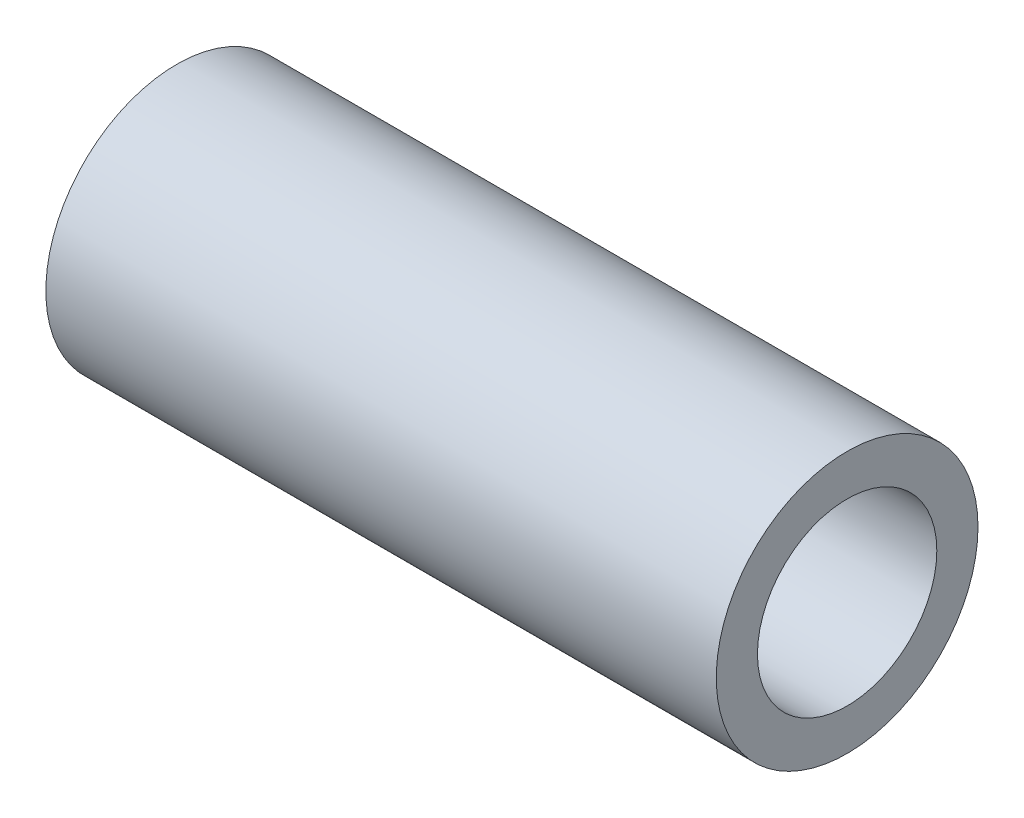
ISO-10303-21;
HEADER;
FILE_DESCRIPTION(('STEP AP214'),'2;1');
FILE_NAME('part.step','',(''),(''),'','','');
FILE_SCHEMA(('AUTOMOTIVE_DESIGN { 1 0 10303 214 1 1 1 1 }'));
ENDSEC;
DATA;
#1=APPLICATION_CONTEXT('core data for automotive mechanical design processes');
#2=APPLICATION_PROTOCOL_DEFINITION('international standard','automotive_design',2000,#1);
#3=PRODUCT_CONTEXT('',#1,'mechanical');
#4=PRODUCT('Part','Part','',(#3));
#5=PRODUCT_RELATED_PRODUCT_CATEGORY('part','',(#4));
#6=PRODUCT_DEFINITION_FORMATION('','',#4);
#7=PRODUCT_DEFINITION_CONTEXT('part definition',#1,'design');
#8=PRODUCT_DEFINITION('design','',#6,#7);
#9=PRODUCT_DEFINITION_SHAPE('','',#8);
#10=(LENGTH_UNIT() NAMED_UNIT(*) SI_UNIT(.MILLI.,.METRE.));
#11=(NAMED_UNIT(*) PLANE_ANGLE_UNIT() SI_UNIT($,.RADIAN.));
#12=(NAMED_UNIT(*) SI_UNIT($,.STERADIAN.) SOLID_ANGLE_UNIT());
#13=UNCERTAINTY_MEASURE_WITH_UNIT(LENGTH_MEASURE(1.E-05),#10,'distance_accuracy_value','');
#14=(GEOMETRIC_REPRESENTATION_CONTEXT(3) GLOBAL_UNCERTAINTY_ASSIGNED_CONTEXT((#13)) GLOBAL_UNIT_ASSIGNED_CONTEXT((#10,
#11,#12)) REPRESENTATION_CONTEXT('',''));
#15=CARTESIAN_POINT('',(0.,0.,0.));
#16=DIRECTION('',(0.,0.,1.));
#17=DIRECTION('',(1.,0.,0.));
#18=AXIS2_PLACEMENT_3D('',#15,#16,#17);
#19=CARTESIAN_POINT('',(24.3967,0.,0.));
#20=DIRECTION('',(1.,0.,0.));
#21=DIRECTION('',(0.,0.,-1.));
#22=AXIS2_PLACEMENT_3D('',#19,#20,#21);
#23=PLANE('',#22);
#24=CARTESIAN_POINT('',(24.3967,0.,0.));
#25=DIRECTION('',(1.,0.,0.));
#26=DIRECTION('',(0.,0.,-1.));
#27=AXIS2_PLACEMENT_3D('',#24,#25,#26);
#28=CIRCLE('',#27,4.7625);
#29=CARTESIAN_POINT('',(24.3967,0.,-4.7625));
#30=VERTEX_POINT('',#29);
#31=EDGE_CURVE('E10',#30,#30,#28,.T.);
#32=ORIENTED_EDGE('',*,*,#31,.T.);
#33=EDGE_LOOP('',(#32));
#34=FACE_BOUND('',#33,.T.);
#35=CARTESIAN_POINT('',(24.3967,0.,0.));
#36=DIRECTION('',(1.,0.,0.));
#37=DIRECTION('',(0.,0.,-1.));
#38=AXIS2_PLACEMENT_3D('',#35,#36,#37);
#39=CIRCLE('',#38,3.2639);
#40=CARTESIAN_POINT('',(24.3967,0.,-3.2639));
#41=VERTEX_POINT('',#40);
#42=EDGE_CURVE('E42',#41,#41,#39,.T.);
#43=ORIENTED_EDGE('',*,*,#42,.F.);
#44=EDGE_LOOP('',(#43));
#45=FACE_BOUND('',#44,.T.);
#46=ADVANCED_FACE('F31',(#34,#45),#23,.T.);
#47=CARTESIAN_POINT('',(0.,0.,0.));
#48=DIRECTION('',(1.,0.,0.));
#49=DIRECTION('',(0.,0.,-1.));
#50=AXIS2_PLACEMENT_3D('',#47,#48,#49);
#51=PLANE('',#50);
#52=CARTESIAN_POINT('',(0.,0.,0.));
#53=DIRECTION('',(1.,0.,0.));
#54=DIRECTION('',(0.,0.,-1.));
#55=AXIS2_PLACEMENT_3D('',#52,#53,#54);
#56=CIRCLE('',#55,4.7625);
#57=CARTESIAN_POINT('',(0.,0.,-4.7625));
#58=VERTEX_POINT('',#57);
#59=EDGE_CURVE('E35',#58,#58,#56,.T.);
#60=ORIENTED_EDGE('',*,*,#59,.F.);
#61=EDGE_LOOP('',(#60));
#62=FACE_BOUND('',#61,.T.);
#63=CARTESIAN_POINT('',(0.,0.,0.));
#64=DIRECTION('',(1.,0.,0.));
#65=DIRECTION('',(0.,0.,-1.));
#66=AXIS2_PLACEMENT_3D('',#63,#64,#65);
#67=CIRCLE('',#66,3.2639);
#68=CARTESIAN_POINT('',(0.,0.,-3.2639));
#69=VERTEX_POINT('',#68);
#70=EDGE_CURVE('E44',#69,#69,#67,.T.);
#71=ORIENTED_EDGE('',*,*,#70,.T.);
#72=EDGE_LOOP('',(#71));
#73=FACE_BOUND('',#72,.T.);
#74=ADVANCED_FACE('F54',(#62,#73),#51,.F.);
#75=CARTESIAN_POINT('',(24.3967,0.,0.));
#76=DIRECTION('',(-1.,0.,0.));
#77=DIRECTION('',(0.,0.,1.));
#78=AXIS2_PLACEMENT_3D('',#75,#76,#77);
#79=CYLINDRICAL_SURFACE('',#78,4.7625);
#80=ORIENTED_EDGE('',*,*,#31,.F.);
#81=EDGE_LOOP('',(#80));
#82=FACE_BOUND('',#81,.T.);
#83=ORIENTED_EDGE('',*,*,#59,.T.);
#84=EDGE_LOOP('',(#83));
#85=FACE_BOUND('',#84,.T.);
#86=ADVANCED_FACE('F33',(#82,#85),#79,.T.);
#87=CARTESIAN_POINT('',(24.3967,0.,0.));
#88=DIRECTION('',(-1.,0.,0.));
#89=DIRECTION('',(0.,0.,1.));
#90=AXIS2_PLACEMENT_3D('',#87,#88,#89);
#91=CYLINDRICAL_SURFACE('',#90,3.2639);
#92=ORIENTED_EDGE('',*,*,#42,.T.);
#93=EDGE_LOOP('',(#92));
#94=FACE_BOUND('',#93,.T.);
#95=ORIENTED_EDGE('',*,*,#70,.F.);
#96=EDGE_LOOP('',(#95));
#97=FACE_BOUND('',#96,.T.);
#98=ADVANCED_FACE('F50',(#94,#97),#91,.F.);
#99=CLOSED_SHELL('',(#46,#74,#86,#98));
#100=MANIFOLD_SOLID_BREP('B2',#99);
#101=ADVANCED_BREP_SHAPE_REPRESENTATION('',(#18,#100),#14);
#102=SHAPE_DEFINITION_REPRESENTATION(#9,#101);
ENDSEC;
END-ISO-10303-21;
